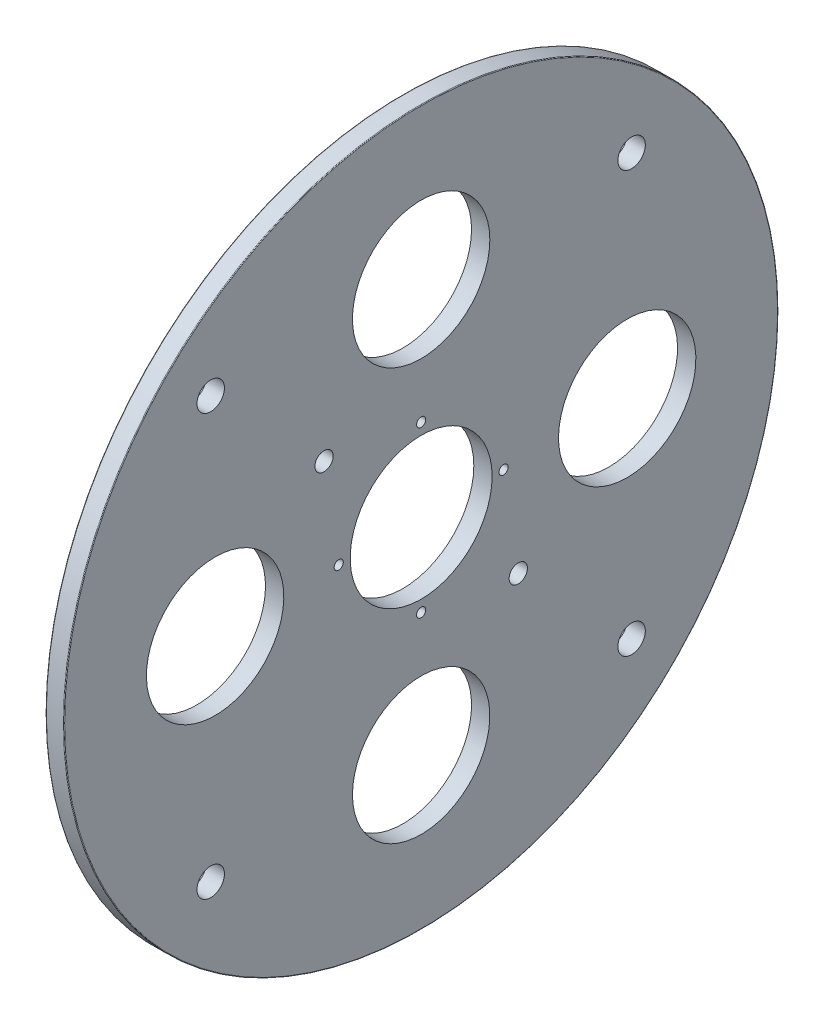
ISO-10303-21;
HEADER;
FILE_DESCRIPTION(('STEP AP214'),'2;1');
FILE_NAME('part.step','',(''),(''),'','','');
FILE_SCHEMA(('AUTOMOTIVE_DESIGN { 1 0 10303 214 1 1 1 1 }'));
ENDSEC;
DATA;
#1=APPLICATION_CONTEXT('core data for automotive mechanical design processes');
#2=APPLICATION_PROTOCOL_DEFINITION('international standard','automotive_design',2000,#1);
#3=PRODUCT_CONTEXT('',#1,'mechanical');
#4=PRODUCT('Part','Part','',(#3));
#5=PRODUCT_RELATED_PRODUCT_CATEGORY('part','',(#4));
#6=PRODUCT_DEFINITION_FORMATION('','',#4);
#7=PRODUCT_DEFINITION_CONTEXT('part definition',#1,'design');
#8=PRODUCT_DEFINITION('design','',#6,#7);
#9=PRODUCT_DEFINITION_SHAPE('','',#8);
#10=(LENGTH_UNIT() NAMED_UNIT(*) SI_UNIT(.MILLI.,.METRE.));
#11=(NAMED_UNIT(*) PLANE_ANGLE_UNIT() SI_UNIT($,.RADIAN.));
#12=(NAMED_UNIT(*) SI_UNIT($,.STERADIAN.) SOLID_ANGLE_UNIT());
#13=UNCERTAINTY_MEASURE_WITH_UNIT(LENGTH_MEASURE(1.E-05),#10,'distance_accuracy_value','');
#14=(GEOMETRIC_REPRESENTATION_CONTEXT(3) GLOBAL_UNCERTAINTY_ASSIGNED_CONTEXT((#13)) GLOBAL_UNIT_ASSIGNED_CONTEXT((#10,
#11,#12)) REPRESENTATION_CONTEXT('',''));
#15=CARTESIAN_POINT('',(0.,0.,0.));
#16=DIRECTION('',(0.,0.,1.));
#17=DIRECTION('',(1.,0.,0.));
#18=AXIS2_PLACEMENT_3D('',#15,#16,#17);
#19=CARTESIAN_POINT('',(8.,0.,0.));
#20=DIRECTION('',(-1.,0.,0.));
#21=DIRECTION('',(0.,0.,1.));
#22=AXIS2_PLACEMENT_3D('',#19,#20,#21);
#23=CYLINDRICAL_SURFACE('',#22,156.);
#24=CARTESIAN_POINT('',(0.3,0.,0.));
#25=DIRECTION('',(1.,0.,0.));
#26=DIRECTION('',(0.,0.,-1.));
#27=AXIS2_PLACEMENT_3D('',#24,#25,#26);
#28=CIRCLE('',#27,156.);
#29=CARTESIAN_POINT('',(0.3,0.,-156.));
#30=VERTEX_POINT('',#29);
#31=EDGE_CURVE('E48',#30,#30,#28,.T.);
#32=ORIENTED_EDGE('',*,*,#31,.T.);
#33=EDGE_LOOP('',(#32));
#34=FACE_BOUND('',#33,.T.);
#35=CARTESIAN_POINT('',(7.7,0.,0.));
#36=DIRECTION('',(1.,0.,0.));
#37=DIRECTION('',(0.,0.,-1.));
#38=AXIS2_PLACEMENT_3D('',#35,#36,#37);
#39=CIRCLE('',#38,156.);
#40=CARTESIAN_POINT('',(7.7,0.,-156.));
#41=VERTEX_POINT('',#40);
#42=EDGE_CURVE('E101',#41,#41,#39,.F.);
#43=ORIENTED_EDGE('',*,*,#42,.T.);
#44=EDGE_LOOP('',(#43));
#45=FACE_BOUND('',#44,.T.);
#46=ADVANCED_FACE('F35',(#34,#45),#23,.T.);
#47=CARTESIAN_POINT('',(8.,0.,0.));
#48=DIRECTION('',(1.,0.,0.));
#49=DIRECTION('',(0.,0.,-1.));
#50=AXIS2_PLACEMENT_3D('',#47,#48,#49);
#51=PLANE('',#50);
#52=CARTESIAN_POINT('',(8.,42.4264068711929,42.4264068711929));
#53=DIRECTION('',(1.,0.,0.));
#54=DIRECTION('',(0.,0.,1.));
#55=AXIS2_PLACEMENT_3D('',#52,#53,#54);
#56=CIRCLE('',#55,4.00000000000001);
#57=CARTESIAN_POINT('',(8.,42.4264068711929,46.4264068711929));
#58=VERTEX_POINT('',#57);
#59=EDGE_CURVE('E210',#58,#58,#56,.T.);
#60=ORIENTED_EDGE('',*,*,#59,.F.);
#61=EDGE_LOOP('',(#60));
#62=FACE_BOUND('',#61,.T.);
#63=CARTESIAN_POINT('',(8.,-3.14233320495882E-13,90.));
#64=DIRECTION('',(1.,0.,0.));
#65=DIRECTION('',(0.,1.,0.));
#66=AXIS2_PLACEMENT_3D('',#63,#64,#65);
#67=CIRCLE('',#66,30.);
#68=CARTESIAN_POINT('',(8.,29.9999999999997,90.0000000000001));
#69=VERTEX_POINT('',#68);
#70=EDGE_CURVE('E221',#69,#69,#67,.T.);
#71=ORIENTED_EDGE('',*,*,#70,.F.);
#72=EDGE_LOOP('',(#71));
#73=FACE_BOUND('',#72,.T.);
#74=CARTESIAN_POINT('',(8.,-90.,0.));
#75=DIRECTION('',(1.,0.,0.));
#76=DIRECTION('',(0.,0.,1.));
#77=AXIS2_PLACEMENT_3D('',#74,#75,#76);
#78=CIRCLE('',#77,30.);
#79=CARTESIAN_POINT('',(8.,-90.,30.));
#80=VERTEX_POINT('',#79);
#81=EDGE_CURVE('E228',#80,#80,#78,.T.);
#82=ORIENTED_EDGE('',*,*,#81,.F.);
#83=EDGE_LOOP('',(#82));
#84=FACE_BOUND('',#83,.T.);
#85=CARTESIAN_POINT('',(8.,9.42699961487646E-13,-90.));
#86=DIRECTION('',(1.,0.,0.));
#87=DIRECTION('',(0.,-1.,0.));
#88=AXIS2_PLACEMENT_3D('',#85,#86,#87);
#89=CIRCLE('',#88,30.);
#90=CARTESIAN_POINT('',(8.,-29.9999999999991,-90.0000000000003));
#91=VERTEX_POINT('',#90);
#92=EDGE_CURVE('E214',#91,#91,#89,.T.);
#93=ORIENTED_EDGE('',*,*,#92,.F.);
#94=EDGE_LOOP('',(#93));
#95=FACE_BOUND('',#94,.T.);
#96=CARTESIAN_POINT('',(8.,90.,0.));
#97=DIRECTION('',(1.,0.,0.));
#98=DIRECTION('',(0.,0.,-1.));
#99=AXIS2_PLACEMENT_3D('',#96,#97,#98);
#100=CIRCLE('',#99,30.);
#101=CARTESIAN_POINT('',(8.,90.,-30.));
#102=VERTEX_POINT('',#101);
#103=EDGE_CURVE('E65',#102,#102,#100,.T.);
#104=ORIENTED_EDGE('',*,*,#103,.F.);
#105=EDGE_LOOP('',(#104));
#106=FACE_BOUND('',#105,.T.);
#107=CARTESIAN_POINT('',(8.,-42.4264068711929,-42.4264068711929));
#108=DIRECTION('',(1.,0.,0.));
#109=DIRECTION('',(0.,0.,-1.));
#110=AXIS2_PLACEMENT_3D('',#107,#108,#109);
#111=CIRCLE('',#110,4.00000000000001);
#112=CARTESIAN_POINT('',(8.,-42.4264068711929,-46.4264068711929));
#113=VERTEX_POINT('',#112);
#114=EDGE_CURVE('E54',#113,#113,#111,.T.);
#115=ORIENTED_EDGE('',*,*,#114,.F.);
#116=EDGE_LOOP('',(#115));
#117=FACE_BOUND('',#116,.T.);
#118=CARTESIAN_POINT('',(8.,0.,0.));
#119=DIRECTION('',(1.,0.,0.));
#120=DIRECTION('',(0.,0.,-1.));
#121=AXIS2_PLACEMENT_3D('',#118,#119,#120);
#122=CIRCLE('',#121,155.7);
#123=CARTESIAN_POINT('',(8.,0.,-155.7));
#124=VERTEX_POINT('',#123);
#125=EDGE_CURVE('E10',#124,#124,#122,.T.);
#126=ORIENTED_EDGE('',*,*,#125,.T.);
#127=EDGE_LOOP('',(#126));
#128=FACE_BOUND('',#127,.T.);
#129=CARTESIAN_POINT('',(8.,-1.25693328198353E-13,-36.));
#130=DIRECTION('',(1.,0.,0.));
#131=DIRECTION('',(0.,-1.,0.));
#132=AXIS2_PLACEMENT_3D('',#129,#130,#131);
#133=CIRCLE('',#132,2.);
#134=CARTESIAN_POINT('',(8.,-2.00000000000013,-36.));
#135=VERTEX_POINT('',#134);
#136=EDGE_CURVE('E69',#135,#135,#133,.T.);
#137=ORIENTED_EDGE('',*,*,#136,.F.);
#138=EDGE_LOOP('',(#137));
#139=FACE_BOUND('',#138,.T.);
#140=CARTESIAN_POINT('',(8.,-36.,0.));
#141=DIRECTION('',(1.,0.,0.));
#142=DIRECTION('',(0.,0.,1.));
#143=AXIS2_PLACEMENT_3D('',#140,#141,#142);
#144=CIRCLE('',#143,2.);
#145=CARTESIAN_POINT('',(8.,-36.,2.));
#146=VERTEX_POINT('',#145);
#147=EDGE_CURVE('E58',#146,#146,#144,.T.);
#148=ORIENTED_EDGE('',*,*,#147,.F.);
#149=EDGE_LOOP('',(#148));
#150=FACE_BOUND('',#149,.T.);
#151=CARTESIAN_POINT('',(8.,3.77079984595058E-13,36.));
#152=DIRECTION('',(1.,0.,0.));
#153=DIRECTION('',(0.,1.,0.));
#154=AXIS2_PLACEMENT_3D('',#151,#152,#153);
#155=CIRCLE('',#154,2.);
#156=CARTESIAN_POINT('',(8.,2.00000000000038,36.));
#157=VERTEX_POINT('',#156);
#158=EDGE_CURVE('E53',#157,#157,#155,.T.);
#159=ORIENTED_EDGE('',*,*,#158,.F.);
#160=EDGE_LOOP('',(#159));
#161=FACE_BOUND('',#160,.T.);
#162=CARTESIAN_POINT('',(8.,36.,0.));
#163=DIRECTION('',(1.,0.,0.));
#164=DIRECTION('',(0.,0.,-1.));
#165=AXIS2_PLACEMENT_3D('',#162,#163,#164);
#166=CIRCLE('',#165,2.);
#167=CARTESIAN_POINT('',(8.,36.,-2.));
#168=VERTEX_POINT('',#167);
#169=EDGE_CURVE('E75',#168,#168,#166,.T.);
#170=ORIENTED_EDGE('',*,*,#169,.F.);
#171=EDGE_LOOP('',(#170));
#172=FACE_BOUND('',#171,.T.);
#173=CARTESIAN_POINT('',(8.,91.9238815542509,91.9238815542515));
#174=DIRECTION('',(1.,0.,0.));
#175=DIRECTION('',(0.,1.,0.));
#176=AXIS2_PLACEMENT_3D('',#173,#174,#175);
#177=CIRCLE('',#176,6.);
#178=CARTESIAN_POINT('',(8.,97.9238815542509,91.9238815542515));
#179=VERTEX_POINT('',#178);
#180=EDGE_CURVE('E80',#179,#179,#177,.T.);
#181=ORIENTED_EDGE('',*,*,#180,.F.);
#182=EDGE_LOOP('',(#181));
#183=FACE_BOUND('',#182,.T.);
#184=CARTESIAN_POINT('',(8.,-91.9238815542512,91.9238815542512));
#185=DIRECTION('',(1.,0.,0.));
#186=DIRECTION('',(0.,0.,1.));
#187=AXIS2_PLACEMENT_3D('',#184,#185,#186);
#188=CIRCLE('',#187,6.);
#189=CARTESIAN_POINT('',(8.,-91.9238815542512,97.9238815542512));
#190=VERTEX_POINT('',#189);
#191=EDGE_CURVE('E84',#190,#190,#188,.T.);
#192=ORIENTED_EDGE('',*,*,#191,.F.);
#193=EDGE_LOOP('',(#192));
#194=FACE_BOUND('',#193,.T.);
#195=CARTESIAN_POINT('',(8.,-91.9238815542502,-91.9238815542521));
#196=DIRECTION('',(1.,0.,0.));
#197=DIRECTION('',(0.,-1.,0.));
#198=AXIS2_PLACEMENT_3D('',#195,#196,#197);
#199=CIRCLE('',#198,6.);
#200=CARTESIAN_POINT('',(8.,-97.9238815542502,-91.9238815542522));
#201=VERTEX_POINT('',#200);
#202=EDGE_CURVE('E87',#201,#201,#199,.T.);
#203=ORIENTED_EDGE('',*,*,#202,.F.);
#204=EDGE_LOOP('',(#203));
#205=FACE_BOUND('',#204,.T.);
#206=CARTESIAN_POINT('',(8.,91.9238815542512,-91.9238815542512));
#207=DIRECTION('',(1.,0.,0.));
#208=DIRECTION('',(0.,0.,-1.));
#209=AXIS2_PLACEMENT_3D('',#206,#207,#208);
#210=CIRCLE('',#209,6.);
#211=CARTESIAN_POINT('',(8.,91.9238815542512,-97.9238815542512));
#212=VERTEX_POINT('',#211);
#213=EDGE_CURVE('E90',#212,#212,#210,.T.);
#214=ORIENTED_EDGE('',*,*,#213,.F.);
#215=EDGE_LOOP('',(#214));
#216=FACE_BOUND('',#215,.T.);
#217=CARTESIAN_POINT('',(8.,0.,0.));
#218=DIRECTION('',(1.,0.,0.));
#219=DIRECTION('',(0.,0.,-1.));
#220=AXIS2_PLACEMENT_3D('',#217,#218,#219);
#221=CIRCLE('',#220,31.);
#222=CARTESIAN_POINT('',(8.,0.,-31.));
#223=VERTEX_POINT('',#222);
#224=EDGE_CURVE('E95',#223,#223,#221,.T.);
#225=ORIENTED_EDGE('',*,*,#224,.F.);
#226=EDGE_LOOP('',(#225));
#227=FACE_BOUND('',#226,.T.);
#228=ADVANCED_FACE('F142',(#62,#73,#84,#95,#106,#117,#128,#139,#150,#161,#172,#183,#194,#205,
#216,#227),#51,.T.);
#229=CARTESIAN_POINT('',(0.,0.,0.));
#230=DIRECTION('',(1.,0.,0.));
#231=DIRECTION('',(0.,0.,-1.));
#232=AXIS2_PLACEMENT_3D('',#229,#230,#231);
#233=PLANE('',#232);
#234=CARTESIAN_POINT('',(0.,42.4264068711929,42.4264068711929));
#235=DIRECTION('',(1.,0.,0.));
#236=DIRECTION('',(0.,0.,1.));
#237=AXIS2_PLACEMENT_3D('',#234,#235,#236);
#238=CIRCLE('',#237,4.00000000000001);
#239=CARTESIAN_POINT('',(0.,42.4264068711929,46.4264068711929));
#240=VERTEX_POINT('',#239);
#241=EDGE_CURVE('E213',#240,#240,#238,.T.);
#242=ORIENTED_EDGE('',*,*,#241,.T.);
#243=EDGE_LOOP('',(#242));
#244=FACE_BOUND('',#243,.T.);
#245=CARTESIAN_POINT('',(0.,-3.14233320495882E-13,90.));
#246=DIRECTION('',(1.,0.,0.));
#247=DIRECTION('',(0.,1.,0.));
#248=AXIS2_PLACEMENT_3D('',#245,#246,#247);
#249=CIRCLE('',#248,30.);
#250=CARTESIAN_POINT('',(0.,29.9999999999997,90.0000000000001));
#251=VERTEX_POINT('',#250);
#252=EDGE_CURVE('E224',#251,#251,#249,.T.);
#253=ORIENTED_EDGE('',*,*,#252,.T.);
#254=EDGE_LOOP('',(#253));
#255=FACE_BOUND('',#254,.T.);
#256=CARTESIAN_POINT('',(0.,-90.,0.));
#257=DIRECTION('',(1.,0.,0.));
#258=DIRECTION('',(0.,0.,1.));
#259=AXIS2_PLACEMENT_3D('',#256,#257,#258);
#260=CIRCLE('',#259,30.);
#261=CARTESIAN_POINT('',(0.,-90.,30.));
#262=VERTEX_POINT('',#261);
#263=EDGE_CURVE('E225',#262,#262,#260,.T.);
#264=ORIENTED_EDGE('',*,*,#263,.T.);
#265=EDGE_LOOP('',(#264));
#266=FACE_BOUND('',#265,.T.);
#267=CARTESIAN_POINT('',(0.,9.42699961487646E-13,-90.));
#268=DIRECTION('',(1.,0.,0.));
#269=DIRECTION('',(0.,-1.,0.));
#270=AXIS2_PLACEMENT_3D('',#267,#268,#269);
#271=CIRCLE('',#270,30.);
#272=CARTESIAN_POINT('',(0.,-29.9999999999991,-90.0000000000003));
#273=VERTEX_POINT('',#272);
#274=EDGE_CURVE('E217',#273,#273,#271,.T.);
#275=ORIENTED_EDGE('',*,*,#274,.T.);
#276=EDGE_LOOP('',(#275));
#277=FACE_BOUND('',#276,.T.);
#278=CARTESIAN_POINT('',(0.,90.,0.));
#279=DIRECTION('',(1.,0.,0.));
#280=DIRECTION('',(0.,0.,-1.));
#281=AXIS2_PLACEMENT_3D('',#278,#279,#280);
#282=CIRCLE('',#281,30.);
#283=CARTESIAN_POINT('',(0.,90.,-30.));
#284=VERTEX_POINT('',#283);
#285=EDGE_CURVE('E39',#284,#284,#282,.T.);
#286=ORIENTED_EDGE('',*,*,#285,.T.);
#287=EDGE_LOOP('',(#286));
#288=FACE_BOUND('',#287,.T.);
#289=CARTESIAN_POINT('',(0.,-42.4264068711929,-42.4264068711929));
#290=DIRECTION('',(1.,0.,0.));
#291=DIRECTION('',(0.,0.,-1.));
#292=AXIS2_PLACEMENT_3D('',#289,#290,#291);
#293=CIRCLE('',#292,4.00000000000001);
#294=CARTESIAN_POINT('',(0.,-42.4264068711929,-46.4264068711929));
#295=VERTEX_POINT('',#294);
#296=EDGE_CURVE('E51',#295,#295,#293,.T.);
#297=ORIENTED_EDGE('',*,*,#296,.T.);
#298=EDGE_LOOP('',(#297));
#299=FACE_BOUND('',#298,.T.);
#300=CARTESIAN_POINT('',(0.,0.,0.));
#301=DIRECTION('',(1.,0.,0.));
#302=DIRECTION('',(0.,0.,-1.));
#303=AXIS2_PLACEMENT_3D('',#300,#301,#302);
#304=CIRCLE('',#303,155.7);
#305=CARTESIAN_POINT('',(0.,0.,-155.7));
#306=VERTEX_POINT('',#305);
#307=EDGE_CURVE('E43',#306,#306,#304,.F.);
#308=ORIENTED_EDGE('',*,*,#307,.T.);
#309=EDGE_LOOP('',(#308));
#310=FACE_BOUND('',#309,.T.);
#311=CARTESIAN_POINT('',(0.,-1.25693328198353E-13,-36.));
#312=DIRECTION('',(1.,0.,0.));
#313=DIRECTION('',(0.,0.,-1.));
#314=AXIS2_PLACEMENT_3D('',#311,#312,#313);
#315=CIRCLE('',#314,2.);
#316=CARTESIAN_POINT('',(0.,-1.25693328198353E-13,-38.));
#317=VERTEX_POINT('',#316);
#318=EDGE_CURVE('E79',#317,#317,#315,.T.);
#319=ORIENTED_EDGE('',*,*,#318,.T.);
#320=EDGE_LOOP('',(#319));
#321=FACE_BOUND('',#320,.T.);
#322=CARTESIAN_POINT('',(0.,-36.,0.));
#323=DIRECTION('',(1.,0.,0.));
#324=DIRECTION('',(0.,0.,-1.));
#325=AXIS2_PLACEMENT_3D('',#322,#323,#324);
#326=CIRCLE('',#325,2.);
#327=CARTESIAN_POINT('',(0.,-36.,-2.));
#328=VERTEX_POINT('',#327);
#329=EDGE_CURVE('E115',#328,#328,#326,.T.);
#330=ORIENTED_EDGE('',*,*,#329,.T.);
#331=EDGE_LOOP('',(#330));
#332=FACE_BOUND('',#331,.T.);
#333=CARTESIAN_POINT('',(0.,3.77079984595058E-13,36.));
#334=DIRECTION('',(1.,0.,0.));
#335=DIRECTION('',(0.,0.,-1.));
#336=AXIS2_PLACEMENT_3D('',#333,#334,#335);
#337=CIRCLE('',#336,2.);
#338=CARTESIAN_POINT('',(0.,3.77079984595058E-13,34.));
#339=VERTEX_POINT('',#338);
#340=EDGE_CURVE('E72',#339,#339,#337,.T.);
#341=ORIENTED_EDGE('',*,*,#340,.T.);
#342=EDGE_LOOP('',(#341));
#343=FACE_BOUND('',#342,.T.);
#344=CARTESIAN_POINT('',(0.,36.,0.));
#345=DIRECTION('',(1.,0.,0.));
#346=DIRECTION('',(0.,0.,-1.));
#347=AXIS2_PLACEMENT_3D('',#344,#345,#346);
#348=CIRCLE('',#347,2.);
#349=CARTESIAN_POINT('',(0.,36.,-2.));
#350=VERTEX_POINT('',#349);
#351=EDGE_CURVE('E78',#350,#350,#348,.T.);
#352=ORIENTED_EDGE('',*,*,#351,.T.);
#353=EDGE_LOOP('',(#352));
#354=FACE_BOUND('',#353,.T.);
#355=CARTESIAN_POINT('',(0.,91.9238815542509,91.9238815542515));
#356=DIRECTION('',(1.,0.,0.));
#357=DIRECTION('',(0.,0.,-1.));
#358=AXIS2_PLACEMENT_3D('',#355,#356,#357);
#359=CIRCLE('',#358,6.);
#360=CARTESIAN_POINT('',(0.,91.9238815542509,85.9238815542515));
#361=VERTEX_POINT('',#360);
#362=EDGE_CURVE('E94',#361,#361,#359,.T.);
#363=ORIENTED_EDGE('',*,*,#362,.T.);
#364=EDGE_LOOP('',(#363));
#365=FACE_BOUND('',#364,.T.);
#366=CARTESIAN_POINT('',(0.,-91.9238815542512,91.9238815542512));
#367=DIRECTION('',(1.,0.,0.));
#368=DIRECTION('',(0.,0.,-1.));
#369=AXIS2_PLACEMENT_3D('',#366,#367,#368);
#370=CIRCLE('',#369,6.);
#371=CARTESIAN_POINT('',(0.,-91.9238815542512,85.9238815542512));
#372=VERTEX_POINT('',#371);
#373=EDGE_CURVE('E106',#372,#372,#370,.T.);
#374=ORIENTED_EDGE('',*,*,#373,.T.);
#375=EDGE_LOOP('',(#374));
#376=FACE_BOUND('',#375,.T.);
#377=CARTESIAN_POINT('',(0.,-91.9238815542502,-91.9238815542521));
#378=DIRECTION('',(1.,0.,0.));
#379=DIRECTION('',(0.,0.,-1.));
#380=AXIS2_PLACEMENT_3D('',#377,#378,#379);
#381=CIRCLE('',#380,6.);
#382=CARTESIAN_POINT('',(0.,-91.9238815542502,-97.9238815542521));
#383=VERTEX_POINT('',#382);
#384=EDGE_CURVE('E83',#383,#383,#381,.T.);
#385=ORIENTED_EDGE('',*,*,#384,.T.);
#386=EDGE_LOOP('',(#385));
#387=FACE_BOUND('',#386,.T.);
#388=CARTESIAN_POINT('',(0.,91.9238815542512,-91.9238815542512));
#389=DIRECTION('',(1.,0.,0.));
#390=DIRECTION('',(0.,0.,-1.));
#391=AXIS2_PLACEMENT_3D('',#388,#389,#390);
#392=CIRCLE('',#391,6.);
#393=CARTESIAN_POINT('',(0.,91.9238815542512,-97.9238815542512));
#394=VERTEX_POINT('',#393);
#395=EDGE_CURVE('E93',#394,#394,#392,.T.);
#396=ORIENTED_EDGE('',*,*,#395,.T.);
#397=EDGE_LOOP('',(#396));
#398=FACE_BOUND('',#397,.T.);
#399=CARTESIAN_POINT('',(0.,0.,0.));
#400=DIRECTION('',(1.,0.,0.));
#401=DIRECTION('',(0.,0.,-1.));
#402=AXIS2_PLACEMENT_3D('',#399,#400,#401);
#403=CIRCLE('',#402,31.);
#404=CARTESIAN_POINT('',(0.,0.,-31.));
#405=VERTEX_POINT('',#404);
#406=EDGE_CURVE('E98',#405,#405,#403,.T.);
#407=ORIENTED_EDGE('',*,*,#406,.T.);
#408=EDGE_LOOP('',(#407));
#409=FACE_BOUND('',#408,.T.);
#410=ADVANCED_FACE('F146',(#244,#255,#266,#277,#288,#299,#310,#321,#332,#343,#354,#365,#376,
#387,#398,#409),#233,.F.);
#411=CARTESIAN_POINT('',(-2.,0.,0.));
#412=DIRECTION('',(1.,0.,0.));
#413=DIRECTION('',(0.,0.,-1.));
#414=AXIS2_PLACEMENT_3D('',#411,#412,#413);
#415=CYLINDRICAL_SURFACE('',#414,31.);
#416=ORIENTED_EDGE('',*,*,#224,.T.);
#417=EDGE_LOOP('',(#416));
#418=FACE_BOUND('',#417,.T.);
#419=ORIENTED_EDGE('',*,*,#406,.F.);
#420=EDGE_LOOP('',(#419));
#421=FACE_BOUND('',#420,.T.);
#422=ADVANCED_FACE('F151',(#418,#421),#415,.F.);
#423=CARTESIAN_POINT('',(-2.,91.9238815542512,-91.9238815542512));
#424=DIRECTION('',(1.,0.,0.));
#425=DIRECTION('',(0.,0.,-1.));
#426=AXIS2_PLACEMENT_3D('',#423,#424,#425);
#427=CYLINDRICAL_SURFACE('',#426,6.);
#428=ORIENTED_EDGE('',*,*,#213,.T.);
#429=EDGE_LOOP('',(#428));
#430=FACE_BOUND('',#429,.T.);
#431=ORIENTED_EDGE('',*,*,#395,.F.);
#432=EDGE_LOOP('',(#431));
#433=FACE_BOUND('',#432,.T.);
#434=ADVANCED_FACE('F156',(#430,#433),#427,.F.);
#435=CARTESIAN_POINT('',(-2.,-91.9238815542502,-91.9238815542521));
#436=DIRECTION('',(1.,0.,0.));
#437=DIRECTION('',(0.,0.,-1.));
#438=AXIS2_PLACEMENT_3D('',#435,#436,#437);
#439=CYLINDRICAL_SURFACE('',#438,6.);
#440=ORIENTED_EDGE('',*,*,#202,.T.);
#441=EDGE_LOOP('',(#440));
#442=FACE_BOUND('',#441,.T.);
#443=ORIENTED_EDGE('',*,*,#384,.F.);
#444=EDGE_LOOP('',(#443));
#445=FACE_BOUND('',#444,.T.);
#446=ADVANCED_FACE('F160',(#442,#445),#439,.F.);
#447=CARTESIAN_POINT('',(-2.,-91.9238815542512,91.9238815542512));
#448=DIRECTION('',(1.,0.,0.));
#449=DIRECTION('',(0.,0.,-1.));
#450=AXIS2_PLACEMENT_3D('',#447,#448,#449);
#451=CYLINDRICAL_SURFACE('',#450,6.);
#452=ORIENTED_EDGE('',*,*,#191,.T.);
#453=EDGE_LOOP('',(#452));
#454=FACE_BOUND('',#453,.T.);
#455=ORIENTED_EDGE('',*,*,#373,.F.);
#456=EDGE_LOOP('',(#455));
#457=FACE_BOUND('',#456,.T.);
#458=ADVANCED_FACE('F164',(#454,#457),#451,.F.);
#459=CARTESIAN_POINT('',(-2.,91.9238815542509,91.9238815542515));
#460=DIRECTION('',(1.,0.,0.));
#461=DIRECTION('',(0.,0.,-1.));
#462=AXIS2_PLACEMENT_3D('',#459,#460,#461);
#463=CYLINDRICAL_SURFACE('',#462,6.);
#464=ORIENTED_EDGE('',*,*,#180,.T.);
#465=EDGE_LOOP('',(#464));
#466=FACE_BOUND('',#465,.T.);
#467=ORIENTED_EDGE('',*,*,#362,.F.);
#468=EDGE_LOOP('',(#467));
#469=FACE_BOUND('',#468,.T.);
#470=ADVANCED_FACE('F168',(#466,#469),#463,.F.);
#471=CARTESIAN_POINT('',(-2.,36.,0.));
#472=DIRECTION('',(1.,0.,0.));
#473=DIRECTION('',(0.,0.,-1.));
#474=AXIS2_PLACEMENT_3D('',#471,#472,#473);
#475=CYLINDRICAL_SURFACE('',#474,2.);
#476=ORIENTED_EDGE('',*,*,#169,.T.);
#477=EDGE_LOOP('',(#476));
#478=FACE_BOUND('',#477,.T.);
#479=ORIENTED_EDGE('',*,*,#351,.F.);
#480=EDGE_LOOP('',(#479));
#481=FACE_BOUND('',#480,.T.);
#482=ADVANCED_FACE('F172',(#478,#481),#475,.F.);
#483=CARTESIAN_POINT('',(-2.,3.77079984595058E-13,36.));
#484=DIRECTION('',(1.,0.,0.));
#485=DIRECTION('',(0.,0.,-1.));
#486=AXIS2_PLACEMENT_3D('',#483,#484,#485);
#487=CYLINDRICAL_SURFACE('',#486,2.);
#488=ORIENTED_EDGE('',*,*,#158,.T.);
#489=EDGE_LOOP('',(#488));
#490=FACE_BOUND('',#489,.T.);
#491=ORIENTED_EDGE('',*,*,#340,.F.);
#492=EDGE_LOOP('',(#491));
#493=FACE_BOUND('',#492,.T.);
#494=ADVANCED_FACE('F176',(#490,#493),#487,.F.);
#495=CARTESIAN_POINT('',(-2.,-36.,0.));
#496=DIRECTION('',(1.,0.,0.));
#497=DIRECTION('',(0.,0.,-1.));
#498=AXIS2_PLACEMENT_3D('',#495,#496,#497);
#499=CYLINDRICAL_SURFACE('',#498,2.);
#500=ORIENTED_EDGE('',*,*,#147,.T.);
#501=EDGE_LOOP('',(#500));
#502=FACE_BOUND('',#501,.T.);
#503=ORIENTED_EDGE('',*,*,#329,.F.);
#504=EDGE_LOOP('',(#503));
#505=FACE_BOUND('',#504,.T.);
#506=ADVANCED_FACE('F136',(#502,#505),#499,.F.);
#507=CARTESIAN_POINT('',(-2.,-1.25693328198353E-13,-36.));
#508=DIRECTION('',(1.,0.,0.));
#509=DIRECTION('',(0.,0.,-1.));
#510=AXIS2_PLACEMENT_3D('',#507,#508,#509);
#511=CYLINDRICAL_SURFACE('',#510,2.);
#512=ORIENTED_EDGE('',*,*,#136,.T.);
#513=EDGE_LOOP('',(#512));
#514=FACE_BOUND('',#513,.T.);
#515=ORIENTED_EDGE('',*,*,#318,.F.);
#516=EDGE_LOOP('',(#515));
#517=FACE_BOUND('',#516,.T.);
#518=ADVANCED_FACE('F128',(#514,#517),#511,.F.);
#519=CARTESIAN_POINT('',(0.3,0.,0.));
#520=DIRECTION('',(1.,0.,0.));
#521=DIRECTION('',(0.,0.,-1.));
#522=AXIS2_PLACEMENT_3D('',#519,#520,#521);
#523=TOROIDAL_SURFACE('',#522,155.7,0.3);
#524=ORIENTED_EDGE('',*,*,#307,.F.);
#525=EDGE_LOOP('',(#524));
#526=FACE_BOUND('',#525,.T.);
#527=ORIENTED_EDGE('',*,*,#31,.F.);
#528=EDGE_LOOP('',(#527));
#529=FACE_BOUND('',#528,.T.);
#530=ADVANCED_FACE('F126',(#526,#529),#523,.T.);
#531=CARTESIAN_POINT('',(7.7,0.,0.));
#532=DIRECTION('',(1.,0.,0.));
#533=DIRECTION('',(0.,0.,-1.));
#534=AXIS2_PLACEMENT_3D('',#531,#532,#533);
#535=TOROIDAL_SURFACE('',#534,155.7,0.3);
#536=ORIENTED_EDGE('',*,*,#42,.F.);
#537=EDGE_LOOP('',(#536));
#538=FACE_BOUND('',#537,.T.);
#539=ORIENTED_EDGE('',*,*,#125,.F.);
#540=EDGE_LOOP('',(#539));
#541=FACE_BOUND('',#540,.T.);
#542=ADVANCED_FACE('F37',(#538,#541),#535,.T.);
#543=CARTESIAN_POINT('',(-2.,-42.4264068711929,-42.4264068711929));
#544=DIRECTION('',(1.,0.,0.));
#545=DIRECTION('',(0.,0.,-1.));
#546=AXIS2_PLACEMENT_3D('',#543,#544,#545);
#547=CYLINDRICAL_SURFACE('',#546,4.00000000000001);
#548=ORIENTED_EDGE('',*,*,#114,.T.);
#549=EDGE_LOOP('',(#548));
#550=FACE_BOUND('',#549,.T.);
#551=ORIENTED_EDGE('',*,*,#296,.F.);
#552=EDGE_LOOP('',(#551));
#553=FACE_BOUND('',#552,.T.);
#554=ADVANCED_FACE('F134',(#550,#553),#547,.F.);
#555=CARTESIAN_POINT('',(-2.,90.,0.));
#556=DIRECTION('',(1.,0.,0.));
#557=DIRECTION('',(0.,0.,-1.));
#558=AXIS2_PLACEMENT_3D('',#555,#556,#557);
#559=CYLINDRICAL_SURFACE('',#558,30.);
#560=ORIENTED_EDGE('',*,*,#103,.T.);
#561=EDGE_LOOP('',(#560));
#562=FACE_BOUND('',#561,.T.);
#563=ORIENTED_EDGE('',*,*,#285,.F.);
#564=EDGE_LOOP('',(#563));
#565=FACE_BOUND('',#564,.T.);
#566=ADVANCED_FACE('F186',(#562,#565),#559,.F.);
#567=CARTESIAN_POINT('',(-2.,9.42699961487646E-13,-90.));
#568=DIRECTION('',(1.,0.,0.));
#569=DIRECTION('',(0.,-1.,0.));
#570=AXIS2_PLACEMENT_3D('',#567,#568,#569);
#571=CYLINDRICAL_SURFACE('',#570,30.);
#572=ORIENTED_EDGE('',*,*,#92,.T.);
#573=EDGE_LOOP('',(#572));
#574=FACE_BOUND('',#573,.T.);
#575=ORIENTED_EDGE('',*,*,#274,.F.);
#576=EDGE_LOOP('',(#575));
#577=FACE_BOUND('',#576,.T.);
#578=ADVANCED_FACE('F189',(#574,#577),#571,.F.);
#579=CARTESIAN_POINT('',(-2.,-90.,0.));
#580=DIRECTION('',(1.,0.,0.));
#581=DIRECTION('',(0.,0.,1.));
#582=AXIS2_PLACEMENT_3D('',#579,#580,#581);
#583=CYLINDRICAL_SURFACE('',#582,30.);
#584=ORIENTED_EDGE('',*,*,#81,.T.);
#585=EDGE_LOOP('',(#584));
#586=FACE_BOUND('',#585,.T.);
#587=ORIENTED_EDGE('',*,*,#263,.F.);
#588=EDGE_LOOP('',(#587));
#589=FACE_BOUND('',#588,.T.);
#590=ADVANCED_FACE('F193',(#586,#589),#583,.F.);
#591=CARTESIAN_POINT('',(-2.,-3.14233320495882E-13,90.));
#592=DIRECTION('',(1.,0.,0.));
#593=DIRECTION('',(0.,1.,0.));
#594=AXIS2_PLACEMENT_3D('',#591,#592,#593);
#595=CYLINDRICAL_SURFACE('',#594,30.);
#596=ORIENTED_EDGE('',*,*,#70,.T.);
#597=EDGE_LOOP('',(#596));
#598=FACE_BOUND('',#597,.T.);
#599=ORIENTED_EDGE('',*,*,#252,.F.);
#600=EDGE_LOOP('',(#599));
#601=FACE_BOUND('',#600,.T.);
#602=ADVANCED_FACE('F197',(#598,#601),#595,.F.);
#603=CARTESIAN_POINT('',(-2.,42.4264068711929,42.4264068711929));
#604=DIRECTION('',(1.,0.,0.));
#605=DIRECTION('',(0.,0.,1.));
#606=AXIS2_PLACEMENT_3D('',#603,#604,#605);
#607=CYLINDRICAL_SURFACE('',#606,4.00000000000001);
#608=ORIENTED_EDGE('',*,*,#59,.T.);
#609=EDGE_LOOP('',(#608));
#610=FACE_BOUND('',#609,.T.);
#611=ORIENTED_EDGE('',*,*,#241,.F.);
#612=EDGE_LOOP('',(#611));
#613=FACE_BOUND('',#612,.T.);
#614=ADVANCED_FACE('F201',(#610,#613),#607,.F.);
#615=CLOSED_SHELL('',(#46,#228,#410,#422,#434,#446,#458,#470,#482,#494,#506,#518,#530,#542,#554,
#566,#578,#590,#602,#614));
#616=MANIFOLD_SOLID_BREP('B2',#615);
#617=ADVANCED_BREP_SHAPE_REPRESENTATION('',(#18,#616),#14);
#618=SHAPE_DEFINITION_REPRESENTATION(#9,#617);
ENDSEC;
END-ISO-10303-21;
